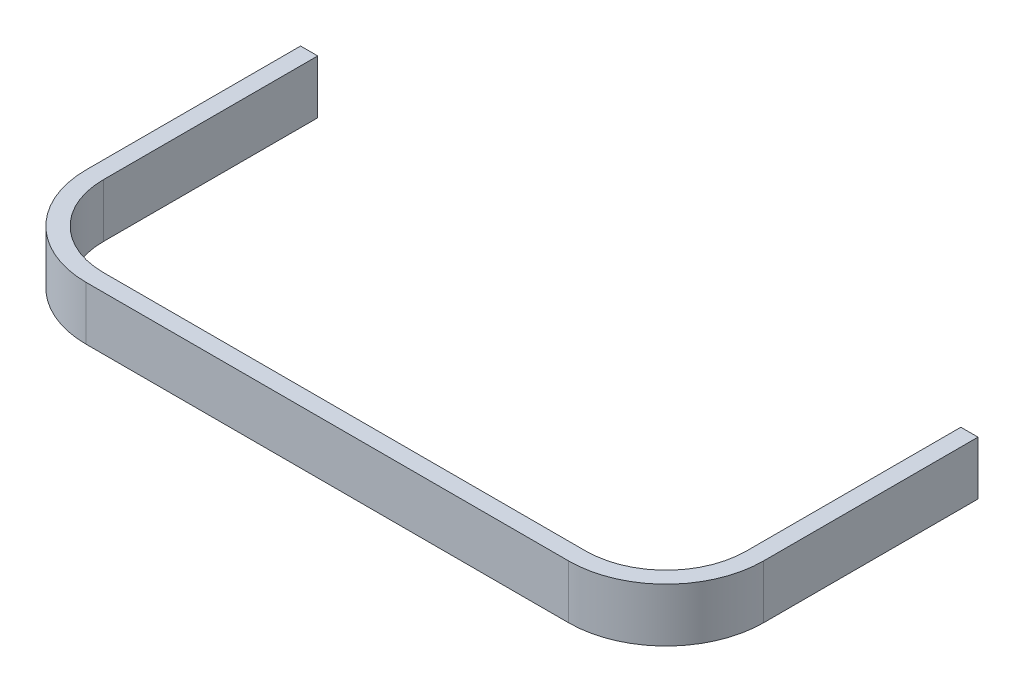
ISO-10303-21;
HEADER;
FILE_DESCRIPTION(('STEP AP214'),'2;1');
FILE_NAME('part.step','',(''),(''),'','','');
FILE_SCHEMA(('AUTOMOTIVE_DESIGN { 1 0 10303 214 1 1 1 1 }'));
ENDSEC;
DATA;
#1=APPLICATION_CONTEXT('core data for automotive mechanical design processes');
#2=APPLICATION_PROTOCOL_DEFINITION('international standard','automotive_design',2000,#1);
#3=PRODUCT_CONTEXT('',#1,'mechanical');
#4=PRODUCT('Part','Part','',(#3));
#5=PRODUCT_RELATED_PRODUCT_CATEGORY('part','',(#4));
#6=PRODUCT_DEFINITION_FORMATION('','',#4);
#7=PRODUCT_DEFINITION_CONTEXT('part definition',#1,'design');
#8=PRODUCT_DEFINITION('design','',#6,#7);
#9=PRODUCT_DEFINITION_SHAPE('','',#8);
#10=(LENGTH_UNIT() NAMED_UNIT(*) SI_UNIT(.MILLI.,.METRE.));
#11=(NAMED_UNIT(*) PLANE_ANGLE_UNIT() SI_UNIT($,.RADIAN.));
#12=(NAMED_UNIT(*) SI_UNIT($,.STERADIAN.) SOLID_ANGLE_UNIT());
#13=UNCERTAINTY_MEASURE_WITH_UNIT(LENGTH_MEASURE(1.E-05),#10,'distance_accuracy_value','');
#14=(GEOMETRIC_REPRESENTATION_CONTEXT(3) GLOBAL_UNCERTAINTY_ASSIGNED_CONTEXT((#13)) GLOBAL_UNIT_ASSIGNED_CONTEXT((#10,
#11,#12)) REPRESENTATION_CONTEXT('',''));
#15=CARTESIAN_POINT('',(0.,0.,0.));
#16=DIRECTION('',(0.,0.,1.));
#17=DIRECTION('',(1.,0.,0.));
#18=AXIS2_PLACEMENT_3D('',#15,#16,#17);
#19=CARTESIAN_POINT('',(-76.2,12.7,0.));
#20=DIRECTION('',(0.,0.,1.));
#21=DIRECTION('',(1.,0.,0.));
#22=AXIS2_PLACEMENT_3D('',#19,#20,#21);
#23=PLANE('',#22);
#24=DIRECTION('',(-1.,0.,0.));
#25=VECTOR('',#24,1.);
#26=CARTESIAN_POINT('',(-76.2,0.,0.));
#27=LINE('',#26,#25);
#28=CARTESIAN_POINT('',(-76.2,0.,0.));
#29=VERTEX_POINT('',#28);
#30=CARTESIAN_POINT('',(-80.264,0.,0.));
#31=VERTEX_POINT('',#30);
#32=EDGE_CURVE('E159',#29,#31,#27,.T.);
#33=ORIENTED_EDGE('',*,*,#32,.T.);
#34=DIRECTION('',(0.,-1.,0.));
#35=VECTOR('',#34,1.);
#36=CARTESIAN_POINT('',(-80.264,12.7,0.));
#37=LINE('',#36,#35);
#38=CARTESIAN_POINT('',(-80.264,12.7,0.));
#39=VERTEX_POINT('',#38);
#40=EDGE_CURVE('E11',#39,#31,#37,.T.);
#41=ORIENTED_EDGE('',*,*,#40,.F.);
#42=DIRECTION('',(-1.,0.,0.));
#43=VECTOR('',#42,1.);
#44=CARTESIAN_POINT('',(-76.2,12.7,0.));
#45=LINE('',#44,#43);
#46=CARTESIAN_POINT('',(-76.2,12.7,0.));
#47=VERTEX_POINT('',#46);
#48=EDGE_CURVE('E181',#47,#39,#45,.T.);
#49=ORIENTED_EDGE('',*,*,#48,.F.);
#50=DIRECTION('',(0.,-1.,0.));
#51=VECTOR('',#50,1.);
#52=CARTESIAN_POINT('',(-76.2,12.7,0.));
#53=LINE('',#52,#51);
#54=EDGE_CURVE('E155',#47,#29,#53,.T.);
#55=ORIENTED_EDGE('',*,*,#54,.T.);
#56=EDGE_LOOP('',(#33,#41,#49,#55));
#57=FACE_BOUND('',#56,.T.);
#58=ADVANCED_FACE('F39',(#57),#23,.F.);
#59=CARTESIAN_POINT('',(-80.264,12.7,0.));
#60=DIRECTION('',(1.,0.,0.));
#61=DIRECTION('',(0.,0.,-1.));
#62=AXIS2_PLACEMENT_3D('',#59,#60,#61);
#63=PLANE('',#62);
#64=DIRECTION('',(0.,0.,1.));
#65=VECTOR('',#64,1.);
#66=CARTESIAN_POINT('',(-80.264,0.,0.));
#67=LINE('',#66,#65);
#68=CARTESIAN_POINT('',(-80.264,0.,50.8));
#69=VERTEX_POINT('',#68);
#70=EDGE_CURVE('E162',#31,#69,#67,.T.);
#71=ORIENTED_EDGE('',*,*,#70,.T.);
#72=DIRECTION('',(0.,-1.,0.));
#73=VECTOR('',#72,1.);
#74=CARTESIAN_POINT('',(-80.264,12.7,50.8));
#75=LINE('',#74,#73);
#76=CARTESIAN_POINT('',(-80.264,12.7,50.8));
#77=VERTEX_POINT('',#76);
#78=EDGE_CURVE('E47',#77,#69,#75,.T.);
#79=ORIENTED_EDGE('',*,*,#78,.F.);
#80=DIRECTION('',(0.,0.,1.));
#81=VECTOR('',#80,1.);
#82=CARTESIAN_POINT('',(-80.264,12.7,0.));
#83=LINE('',#82,#81);
#84=EDGE_CURVE('E110',#39,#77,#83,.T.);
#85=ORIENTED_EDGE('',*,*,#84,.F.);
#86=ORIENTED_EDGE('',*,*,#40,.T.);
#87=EDGE_LOOP('',(#71,#79,#85,#86));
#88=FACE_BOUND('',#87,.T.);
#89=ADVANCED_FACE('F259',(#88),#63,.F.);
#90=CARTESIAN_POINT('',(-57.15,12.7,50.8));
#91=DIRECTION('',(0.,-1.,0.));
#92=DIRECTION('',(0.,0.,-1.));
#93=AXIS2_PLACEMENT_3D('',#90,#91,#92);
#94=CYLINDRICAL_SURFACE('',#93,23.114);
#95=CARTESIAN_POINT('',(-57.15,0.,50.8));
#96=DIRECTION('',(0.,1.,0.));
#97=DIRECTION('',(0.,0.,1.));
#98=AXIS2_PLACEMENT_3D('',#95,#96,#97);
#99=CIRCLE('',#98,23.114);
#100=CARTESIAN_POINT('',(-57.15,0.,73.914));
#101=VERTEX_POINT('',#100);
#102=EDGE_CURVE('E164',#69,#101,#99,.T.);
#103=ORIENTED_EDGE('',*,*,#102,.T.);
#104=DIRECTION('',(0.,-1.,0.));
#105=VECTOR('',#104,1.);
#106=CARTESIAN_POINT('',(-57.15,12.7,73.914));
#107=LINE('',#106,#105);
#108=CARTESIAN_POINT('',(-57.15,12.7,73.914));
#109=VERTEX_POINT('',#108);
#110=EDGE_CURVE('E200',#109,#101,#107,.T.);
#111=ORIENTED_EDGE('',*,*,#110,.F.);
#112=CARTESIAN_POINT('',(-57.15,12.7,50.8));
#113=DIRECTION('',(0.,1.,0.));
#114=DIRECTION('',(0.,0.,1.));
#115=AXIS2_PLACEMENT_3D('',#112,#113,#114);
#116=CIRCLE('',#115,23.114);
#117=EDGE_CURVE('E208',#77,#109,#116,.T.);
#118=ORIENTED_EDGE('',*,*,#117,.F.);
#119=ORIENTED_EDGE('',*,*,#78,.T.);
#120=EDGE_LOOP('',(#103,#111,#118,#119));
#121=FACE_BOUND('',#120,.T.);
#122=ADVANCED_FACE('F206',(#121),#94,.T.);
#123=CARTESIAN_POINT('',(-57.15,12.7,73.914));
#124=DIRECTION('',(0.,0.,-1.));
#125=DIRECTION('',(-1.,0.,0.));
#126=AXIS2_PLACEMENT_3D('',#123,#124,#125);
#127=PLANE('',#126);
#128=DIRECTION('',(1.,0.,0.));
#129=VECTOR('',#128,1.);
#130=CARTESIAN_POINT('',(-57.15,0.,73.914));
#131=LINE('',#130,#129);
#132=CARTESIAN_POINT('',(57.15,0.,73.914));
#133=VERTEX_POINT('',#132);
#134=EDGE_CURVE('E166',#101,#133,#131,.T.);
#135=ORIENTED_EDGE('',*,*,#134,.T.);
#136=DIRECTION('',(0.,-1.,0.));
#137=VECTOR('',#136,1.);
#138=CARTESIAN_POINT('',(57.15,12.7,73.914));
#139=LINE('',#138,#137);
#140=CARTESIAN_POINT('',(57.15,12.7,73.914));
#141=VERTEX_POINT('',#140);
#142=EDGE_CURVE('E197',#141,#133,#139,.T.);
#143=ORIENTED_EDGE('',*,*,#142,.F.);
#144=DIRECTION('',(1.,0.,0.));
#145=VECTOR('',#144,1.);
#146=CARTESIAN_POINT('',(-57.15,12.7,73.914));
#147=LINE('',#146,#145);
#148=EDGE_CURVE('E226',#109,#141,#147,.T.);
#149=ORIENTED_EDGE('',*,*,#148,.F.);
#150=ORIENTED_EDGE('',*,*,#110,.T.);
#151=EDGE_LOOP('',(#135,#143,#149,#150));
#152=FACE_BOUND('',#151,.T.);
#153=ADVANCED_FACE('F217',(#152),#127,.F.);
#154=CARTESIAN_POINT('',(57.15,12.7,50.8));
#155=DIRECTION('',(0.,-1.,0.));
#156=DIRECTION('',(0.,0.,-1.));
#157=AXIS2_PLACEMENT_3D('',#154,#155,#156);
#158=CYLINDRICAL_SURFACE('',#157,23.114);
#159=CARTESIAN_POINT('',(57.15,0.,50.8));
#160=DIRECTION('',(0.,1.,0.));
#161=DIRECTION('',(0.,0.,1.));
#162=AXIS2_PLACEMENT_3D('',#159,#160,#161);
#163=CIRCLE('',#162,23.114);
#164=CARTESIAN_POINT('',(80.264,0.,50.8));
#165=VERTEX_POINT('',#164);
#166=EDGE_CURVE('E168',#133,#165,#163,.T.);
#167=ORIENTED_EDGE('',*,*,#166,.T.);
#168=DIRECTION('',(0.,-1.,0.));
#169=VECTOR('',#168,1.);
#170=CARTESIAN_POINT('',(80.264,12.7,50.8));
#171=LINE('',#170,#169);
#172=CARTESIAN_POINT('',(80.264,12.7,50.8));
#173=VERTEX_POINT('',#172);
#174=EDGE_CURVE('E194',#173,#165,#171,.T.);
#175=ORIENTED_EDGE('',*,*,#174,.F.);
#176=CARTESIAN_POINT('',(57.15,12.7,50.8));
#177=DIRECTION('',(0.,1.,0.));
#178=DIRECTION('',(0.,0.,1.));
#179=AXIS2_PLACEMENT_3D('',#176,#177,#178);
#180=CIRCLE('',#179,23.114);
#181=EDGE_CURVE('E223',#141,#173,#180,.T.);
#182=ORIENTED_EDGE('',*,*,#181,.F.);
#183=ORIENTED_EDGE('',*,*,#142,.T.);
#184=EDGE_LOOP('',(#167,#175,#182,#183));
#185=FACE_BOUND('',#184,.T.);
#186=ADVANCED_FACE('F221',(#185),#158,.T.);
#187=CARTESIAN_POINT('',(80.264,12.7,0.));
#188=DIRECTION('',(-1.,0.,0.));
#189=DIRECTION('',(0.,0.,1.));
#190=AXIS2_PLACEMENT_3D('',#187,#188,#189);
#191=PLANE('',#190);
#192=DIRECTION('',(0.,0.,-1.));
#193=VECTOR('',#192,1.);
#194=CARTESIAN_POINT('',(80.264,0.,0.));
#195=LINE('',#194,#193);
#196=CARTESIAN_POINT('',(80.264,0.,0.));
#197=VERTEX_POINT('',#196);
#198=EDGE_CURVE('E170',#165,#197,#195,.T.);
#199=ORIENTED_EDGE('',*,*,#198,.T.);
#200=DIRECTION('',(0.,-1.,0.));
#201=VECTOR('',#200,1.);
#202=CARTESIAN_POINT('',(80.264,12.7,0.));
#203=LINE('',#202,#201);
#204=CARTESIAN_POINT('',(80.264,12.7,0.));
#205=VERTEX_POINT('',#204);
#206=EDGE_CURVE('E191',#205,#197,#203,.T.);
#207=ORIENTED_EDGE('',*,*,#206,.F.);
#208=DIRECTION('',(0.,0.,-1.));
#209=VECTOR('',#208,1.);
#210=CARTESIAN_POINT('',(80.264,12.7,0.));
#211=LINE('',#210,#209);
#212=EDGE_CURVE('E225',#173,#205,#211,.T.);
#213=ORIENTED_EDGE('',*,*,#212,.F.);
#214=ORIENTED_EDGE('',*,*,#174,.T.);
#215=EDGE_LOOP('',(#199,#207,#213,#214));
#216=FACE_BOUND('',#215,.T.);
#217=ADVANCED_FACE('F272',(#216),#191,.F.);
#218=CARTESIAN_POINT('',(76.2,12.7,0.));
#219=DIRECTION('',(0.,0.,1.));
#220=DIRECTION('',(1.,0.,0.));
#221=AXIS2_PLACEMENT_3D('',#218,#219,#220);
#222=PLANE('',#221);
#223=DIRECTION('',(-1.,0.,0.));
#224=VECTOR('',#223,1.);
#225=CARTESIAN_POINT('',(76.2,0.,0.));
#226=LINE('',#225,#224);
#227=CARTESIAN_POINT('',(76.2,0.,0.));
#228=VERTEX_POINT('',#227);
#229=EDGE_CURVE('E172',#197,#228,#226,.T.);
#230=ORIENTED_EDGE('',*,*,#229,.T.);
#231=DIRECTION('',(0.,-1.,0.));
#232=VECTOR('',#231,1.);
#233=CARTESIAN_POINT('',(76.2,12.7,0.));
#234=LINE('',#233,#232);
#235=CARTESIAN_POINT('',(76.2,12.7,0.));
#236=VERTEX_POINT('',#235);
#237=EDGE_CURVE('E188',#236,#228,#234,.T.);
#238=ORIENTED_EDGE('',*,*,#237,.F.);
#239=DIRECTION('',(-1.,0.,0.));
#240=VECTOR('',#239,1.);
#241=CARTESIAN_POINT('',(76.2,12.7,0.));
#242=LINE('',#241,#240);
#243=EDGE_CURVE('E228',#205,#236,#242,.T.);
#244=ORIENTED_EDGE('',*,*,#243,.F.);
#245=ORIENTED_EDGE('',*,*,#206,.T.);
#246=EDGE_LOOP('',(#230,#238,#244,#245));
#247=FACE_BOUND('',#246,.T.);
#248=ADVANCED_FACE('F275',(#247),#222,.F.);
#249=CARTESIAN_POINT('',(76.2,12.7,0.));
#250=DIRECTION('',(1.,0.,0.));
#251=DIRECTION('',(0.,0.,-1.));
#252=AXIS2_PLACEMENT_3D('',#249,#250,#251);
#253=PLANE('',#252);
#254=DIRECTION('',(0.,0.,1.));
#255=VECTOR('',#254,1.);
#256=CARTESIAN_POINT('',(76.2,0.,0.));
#257=LINE('',#256,#255);
#258=CARTESIAN_POINT('',(76.2,0.,50.8));
#259=VERTEX_POINT('',#258);
#260=EDGE_CURVE('E174',#228,#259,#257,.T.);
#261=ORIENTED_EDGE('',*,*,#260,.T.);
#262=DIRECTION('',(0.,-1.,0.));
#263=VECTOR('',#262,1.);
#264=CARTESIAN_POINT('',(76.2,12.7,50.8));
#265=LINE('',#264,#263);
#266=CARTESIAN_POINT('',(76.2,12.7,50.8));
#267=VERTEX_POINT('',#266);
#268=EDGE_CURVE('E185',#267,#259,#265,.T.);
#269=ORIENTED_EDGE('',*,*,#268,.F.);
#270=DIRECTION('',(0.,0.,1.));
#271=VECTOR('',#270,1.);
#272=CARTESIAN_POINT('',(76.2,12.7,0.));
#273=LINE('',#272,#271);
#274=EDGE_CURVE('E234',#236,#267,#273,.T.);
#275=ORIENTED_EDGE('',*,*,#274,.F.);
#276=ORIENTED_EDGE('',*,*,#237,.T.);
#277=EDGE_LOOP('',(#261,#269,#275,#276));
#278=FACE_BOUND('',#277,.T.);
#279=ADVANCED_FACE('F240',(#278),#253,.F.);
#280=CARTESIAN_POINT('',(57.15,12.7,50.8));
#281=DIRECTION('',(0.,-1.,0.));
#282=DIRECTION('',(0.,0.,-1.));
#283=AXIS2_PLACEMENT_3D('',#280,#281,#282);
#284=CYLINDRICAL_SURFACE('',#283,19.05);
#285=CARTESIAN_POINT('',(57.15,0.,50.8));
#286=DIRECTION('',(0.,-1.,0.));
#287=DIRECTION('',(0.,0.,1.));
#288=AXIS2_PLACEMENT_3D('',#285,#286,#287);
#289=CIRCLE('',#288,19.05);
#290=CARTESIAN_POINT('',(57.15,0.,69.85));
#291=VERTEX_POINT('',#290);
#292=EDGE_CURVE('E176',#259,#291,#289,.T.);
#293=ORIENTED_EDGE('',*,*,#292,.T.);
#294=DIRECTION('',(0.,-1.,0.));
#295=VECTOR('',#294,1.);
#296=CARTESIAN_POINT('',(57.15,12.7,69.85));
#297=LINE('',#296,#295);
#298=CARTESIAN_POINT('',(57.15,12.7,69.85));
#299=VERTEX_POINT('',#298);
#300=EDGE_CURVE('E150',#299,#291,#297,.T.);
#301=ORIENTED_EDGE('',*,*,#300,.F.);
#302=CARTESIAN_POINT('',(57.15,12.7,50.8));
#303=DIRECTION('',(0.,-1.,0.));
#304=DIRECTION('',(0.,0.,1.));
#305=AXIS2_PLACEMENT_3D('',#302,#303,#304);
#306=CIRCLE('',#305,19.05);
#307=EDGE_CURVE('E141',#267,#299,#306,.T.);
#308=ORIENTED_EDGE('',*,*,#307,.F.);
#309=ORIENTED_EDGE('',*,*,#268,.T.);
#310=EDGE_LOOP('',(#293,#301,#308,#309));
#311=FACE_BOUND('',#310,.T.);
#312=ADVANCED_FACE('F244',(#311),#284,.F.);
#313=CARTESIAN_POINT('',(-57.15,12.7,69.85));
#314=DIRECTION('',(0.,0.,1.));
#315=DIRECTION('',(1.,0.,0.));
#316=AXIS2_PLACEMENT_3D('',#313,#314,#315);
#317=PLANE('',#316);
#318=DIRECTION('',(-1.,0.,0.));
#319=VECTOR('',#318,1.);
#320=CARTESIAN_POINT('',(-57.15,0.,69.85));
#321=LINE('',#320,#319);
#322=CARTESIAN_POINT('',(-57.15,0.,69.85));
#323=VERTEX_POINT('',#322);
#324=EDGE_CURVE('E149',#291,#323,#321,.T.);
#325=ORIENTED_EDGE('',*,*,#324,.T.);
#326=DIRECTION('',(0.,-1.,0.));
#327=VECTOR('',#326,1.);
#328=CARTESIAN_POINT('',(-57.15,12.7,69.85));
#329=LINE('',#328,#327);
#330=CARTESIAN_POINT('',(-57.15,12.7,69.85));
#331=VERTEX_POINT('',#330);
#332=EDGE_CURVE('E146',#331,#323,#329,.T.);
#333=ORIENTED_EDGE('',*,*,#332,.F.);
#334=DIRECTION('',(-1.,0.,0.));
#335=VECTOR('',#334,1.);
#336=CARTESIAN_POINT('',(-57.15,12.7,69.85));
#337=LINE('',#336,#335);
#338=EDGE_CURVE('E135',#299,#331,#337,.T.);
#339=ORIENTED_EDGE('',*,*,#338,.F.);
#340=ORIENTED_EDGE('',*,*,#300,.T.);
#341=EDGE_LOOP('',(#325,#333,#339,#340));
#342=FACE_BOUND('',#341,.T.);
#343=ADVANCED_FACE('F147',(#342),#317,.F.);
#344=CARTESIAN_POINT('',(-57.15,12.7,50.8));
#345=DIRECTION('',(0.,-1.,0.));
#346=DIRECTION('',(0.,0.,-1.));
#347=AXIS2_PLACEMENT_3D('',#344,#345,#346);
#348=CYLINDRICAL_SURFACE('',#347,19.05);
#349=CARTESIAN_POINT('',(-57.15,0.,50.8));
#350=DIRECTION('',(0.,-1.,0.));
#351=DIRECTION('',(0.,0.,1.));
#352=AXIS2_PLACEMENT_3D('',#349,#350,#351);
#353=CIRCLE('',#352,19.05);
#354=CARTESIAN_POINT('',(-76.2,0.,50.8));
#355=VERTEX_POINT('',#354);
#356=EDGE_CURVE('E96',#323,#355,#353,.T.);
#357=ORIENTED_EDGE('',*,*,#356,.T.);
#358=DIRECTION('',(0.,-1.,0.));
#359=VECTOR('',#358,1.);
#360=CARTESIAN_POINT('',(-76.2,12.7,50.8));
#361=LINE('',#360,#359);
#362=CARTESIAN_POINT('',(-76.2,12.7,50.8));
#363=VERTEX_POINT('',#362);
#364=EDGE_CURVE('E151',#363,#355,#361,.T.);
#365=ORIENTED_EDGE('',*,*,#364,.F.);
#366=CARTESIAN_POINT('',(-57.15,12.7,50.8));
#367=DIRECTION('',(0.,-1.,0.));
#368=DIRECTION('',(0.,0.,1.));
#369=AXIS2_PLACEMENT_3D('',#366,#367,#368);
#370=CIRCLE('',#369,19.05);
#371=EDGE_CURVE('E139',#331,#363,#370,.T.);
#372=ORIENTED_EDGE('',*,*,#371,.F.);
#373=ORIENTED_EDGE('',*,*,#332,.T.);
#374=EDGE_LOOP('',(#357,#365,#372,#373));
#375=FACE_BOUND('',#374,.T.);
#376=ADVANCED_FACE('F153',(#375),#348,.F.);
#377=CARTESIAN_POINT('',(-76.2,12.7,0.));
#378=DIRECTION('',(-1.,0.,0.));
#379=DIRECTION('',(0.,0.,1.));
#380=AXIS2_PLACEMENT_3D('',#377,#378,#379);
#381=PLANE('',#380);
#382=DIRECTION('',(0.,0.,-1.));
#383=VECTOR('',#382,1.);
#384=CARTESIAN_POINT('',(-76.2,0.,0.));
#385=LINE('',#384,#383);
#386=EDGE_CURVE('E102',#355,#29,#385,.T.);
#387=ORIENTED_EDGE('',*,*,#386,.T.);
#388=ORIENTED_EDGE('',*,*,#54,.F.);
#389=DIRECTION('',(0.,0.,-1.));
#390=VECTOR('',#389,1.);
#391=CARTESIAN_POINT('',(-76.2,12.7,0.));
#392=LINE('',#391,#390);
#393=EDGE_CURVE('E55',#363,#47,#392,.T.);
#394=ORIENTED_EDGE('',*,*,#393,.F.);
#395=ORIENTED_EDGE('',*,*,#364,.T.);
#396=EDGE_LOOP('',(#387,#388,#394,#395));
#397=FACE_BOUND('',#396,.T.);
#398=ADVANCED_FACE('F248',(#397),#381,.F.);
#399=CARTESIAN_POINT('',(-57.15,12.7,50.8));
#400=DIRECTION('',(0.,1.,0.));
#401=DIRECTION('',(0.,0.,1.));
#402=AXIS2_PLACEMENT_3D('',#399,#400,#401);
#403=PLANE('',#402);
#404=ORIENTED_EDGE('',*,*,#48,.T.);
#405=ORIENTED_EDGE('',*,*,#84,.T.);
#406=ORIENTED_EDGE('',*,*,#117,.T.);
#407=ORIENTED_EDGE('',*,*,#148,.T.);
#408=ORIENTED_EDGE('',*,*,#181,.T.);
#409=ORIENTED_EDGE('',*,*,#212,.T.);
#410=ORIENTED_EDGE('',*,*,#243,.T.);
#411=ORIENTED_EDGE('',*,*,#274,.T.);
#412=ORIENTED_EDGE('',*,*,#307,.T.);
#413=ORIENTED_EDGE('',*,*,#338,.T.);
#414=ORIENTED_EDGE('',*,*,#371,.T.);
#415=ORIENTED_EDGE('',*,*,#393,.T.);
#416=EDGE_LOOP('',(#404,#405,#406,#407,#408,#409,#410,#411,#412,#413,#414,#415));
#417=FACE_BOUND('',#416,.T.);
#418=ADVANCED_FACE('F137',(#417),#403,.T.);
#419=CARTESIAN_POINT('',(-57.15,0.,50.8));
#420=DIRECTION('',(0.,1.,0.));
#421=DIRECTION('',(0.,0.,1.));
#422=AXIS2_PLACEMENT_3D('',#419,#420,#421);
#423=PLANE('',#422);
#424=ORIENTED_EDGE('',*,*,#32,.F.);
#425=ORIENTED_EDGE('',*,*,#386,.F.);
#426=ORIENTED_EDGE('',*,*,#356,.F.);
#427=ORIENTED_EDGE('',*,*,#324,.F.);
#428=ORIENTED_EDGE('',*,*,#292,.F.);
#429=ORIENTED_EDGE('',*,*,#260,.F.);
#430=ORIENTED_EDGE('',*,*,#229,.F.);
#431=ORIENTED_EDGE('',*,*,#198,.F.);
#432=ORIENTED_EDGE('',*,*,#166,.F.);
#433=ORIENTED_EDGE('',*,*,#134,.F.);
#434=ORIENTED_EDGE('',*,*,#102,.F.);
#435=ORIENTED_EDGE('',*,*,#70,.F.);
#436=EDGE_LOOP('',(#424,#425,#426,#427,#428,#429,#430,#431,#432,#433,#434,#435));
#437=FACE_BOUND('',#436,.T.);
#438=ADVANCED_FACE('F212',(#437),#423,.F.);
#439=CLOSED_SHELL('',(#58,#89,#122,#153,#186,#217,#248,#279,#312,#343,#376,#398,#418,#438));
#440=MANIFOLD_SOLID_BREP('B2',#439);
#441=ADVANCED_BREP_SHAPE_REPRESENTATION('',(#18,#440),#14);
#442=SHAPE_DEFINITION_REPRESENTATION(#9,#441);
ENDSEC;
END-ISO-10303-21;
